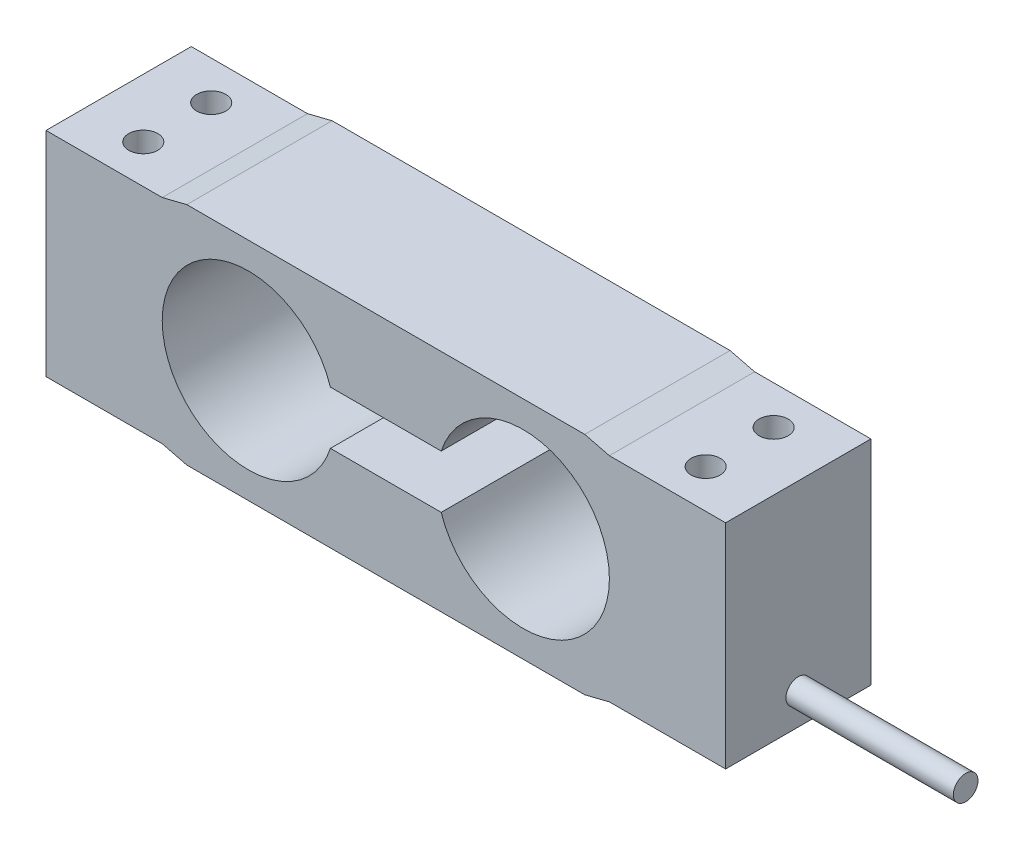
ISO-10303-21;
HEADER;
FILE_DESCRIPTION(('STEP AP214'),'2;1');
FILE_NAME('part.step','',(''),(''),'','','');
FILE_SCHEMA(('AUTOMOTIVE_DESIGN { 1 0 10303 214 1 1 1 1 }'));
ENDSEC;
DATA;
#1=APPLICATION_CONTEXT('core data for automotive mechanical design processes');
#2=APPLICATION_PROTOCOL_DEFINITION('international standard','automotive_design',2000,#1);
#3=PRODUCT_CONTEXT('',#1,'mechanical');
#4=PRODUCT('Part','Part','',(#3));
#5=PRODUCT_RELATED_PRODUCT_CATEGORY('part','',(#4));
#6=PRODUCT_DEFINITION_FORMATION('','',#4);
#7=PRODUCT_DEFINITION_CONTEXT('part definition',#1,'design');
#8=PRODUCT_DEFINITION('design','',#6,#7);
#9=PRODUCT_DEFINITION_SHAPE('','',#8);
#10=(LENGTH_UNIT() NAMED_UNIT(*) SI_UNIT(.MILLI.,.METRE.));
#11=(NAMED_UNIT(*) PLANE_ANGLE_UNIT() SI_UNIT($,.RADIAN.));
#12=(NAMED_UNIT(*) SI_UNIT($,.STERADIAN.) SOLID_ANGLE_UNIT());
#13=UNCERTAINTY_MEASURE_WITH_UNIT(LENGTH_MEASURE(1.E-05),#10,'distance_accuracy_value','');
#14=(GEOMETRIC_REPRESENTATION_CONTEXT(3) GLOBAL_UNCERTAINTY_ASSIGNED_CONTEXT((#13)) GLOBAL_UNIT_ASSIGNED_CONTEXT((#10,
#11,#12)) REPRESENTATION_CONTEXT('',''));
#15=CARTESIAN_POINT('',(0.,0.,0.));
#16=DIRECTION('',(0.,0.,1.));
#17=DIRECTION('',(1.,0.,0.));
#18=AXIS2_PLACEMENT_3D('',#15,#16,#17);
#19=CARTESIAN_POINT('',(0.,21.9964,-14.986));
#20=DIRECTION('',(0.,0.,1.));
#21=DIRECTION('',(1.,0.,0.));
#22=AXIS2_PLACEMENT_3D('',#19,#20,#21);
#23=PLANE('',#22);
#24=DIRECTION('',(0.,1.,0.));
#25=VECTOR('',#24,1.);
#26=CARTESIAN_POINT('',(-11.9888,21.9964,-14.986));
#27=LINE('',#26,#25);
#28=CARTESIAN_POINT('',(-11.9888,0.,-14.986));
#29=VERTEX_POINT('',#28);
#30=CARTESIAN_POINT('',(-11.9888,10.9982,-14.986));
#31=VERTEX_POINT('',#30);
#32=EDGE_CURVE('E44',#29,#31,#27,.T.);
#33=ORIENTED_EDGE('',*,*,#32,.F.);
#34=DIRECTION('',(0.970142500145333,0.242535625036327,0.));
#35=VECTOR('',#34,1.);
#36=CARTESIAN_POINT('',(-14.5288,-0.634999999999955,-14.986));
#37=LINE('',#36,#35);
#38=CARTESIAN_POINT('',(-14.5288,-0.634999999999955,-14.986));
#39=VERTEX_POINT('',#38);
#40=EDGE_CURVE('E226',#39,#29,#37,.T.);
#41=ORIENTED_EDGE('',*,*,#40,.F.);
#42=DIRECTION('',(1.,0.,0.));
#43=VECTOR('',#42,1.);
#44=CARTESIAN_POINT('',(-55.5752,-0.634999999999962,-14.986));
#45=LINE('',#44,#43);
#46=CARTESIAN_POINT('',(-55.5752,-0.634999999999962,-14.986));
#47=VERTEX_POINT('',#46);
#48=EDGE_CURVE('E222',#47,#39,#45,.T.);
#49=ORIENTED_EDGE('',*,*,#48,.F.);
#50=DIRECTION('',(0.970142500145334,-0.242535625036324,0.));
#51=VECTOR('',#50,1.);
#52=CARTESIAN_POINT('',(-58.1152,0.,-14.986));
#53=LINE('',#52,#51);
#54=CARTESIAN_POINT('',(-58.1152,0.,-14.986));
#55=VERTEX_POINT('',#54);
#56=EDGE_CURVE('E219',#55,#47,#53,.T.);
#57=ORIENTED_EDGE('',*,*,#56,.F.);
#58=DIRECTION('',(-1.,0.,0.));
#59=VECTOR('',#58,1.);
#60=CARTESIAN_POINT('',(0.,0.,-14.986));
#61=LINE('',#60,#59);
#62=CARTESIAN_POINT('',(-70.104,0.,-14.986));
#63=VERTEX_POINT('',#62);
#64=EDGE_CURVE('E329',#55,#63,#61,.T.);
#65=ORIENTED_EDGE('',*,*,#64,.T.);
#66=DIRECTION('',(0.,-1.,0.));
#67=VECTOR('',#66,1.);
#68=CARTESIAN_POINT('',(-70.104,21.9964,-14.986));
#69=LINE('',#68,#67);
#70=CARTESIAN_POINT('',(-70.104,21.9964,-14.986));
#71=VERTEX_POINT('',#70);
#72=EDGE_CURVE('E343',#71,#63,#69,.T.);
#73=ORIENTED_EDGE('',*,*,#72,.F.);
#74=DIRECTION('',(-1.,0.,0.));
#75=VECTOR('',#74,1.);
#76=CARTESIAN_POINT('',(0.,21.9964,-14.986));
#77=LINE('',#76,#75);
#78=CARTESIAN_POINT('',(-58.1152,21.9964,-14.986));
#79=VERTEX_POINT('',#78);
#80=EDGE_CURVE('E191',#79,#71,#77,.T.);
#81=ORIENTED_EDGE('',*,*,#80,.F.);
#82=DIRECTION('',(-0.970142500145334,-0.242535625036326,0.));
#83=VECTOR('',#82,1.);
#84=CARTESIAN_POINT('',(-58.1152,21.9964,-14.986));
#85=LINE('',#84,#83);
#86=CARTESIAN_POINT('',(-55.5752,22.6314,-14.986));
#87=VERTEX_POINT('',#86);
#88=EDGE_CURVE('E167',#87,#79,#85,.T.);
#89=ORIENTED_EDGE('',*,*,#88,.F.);
#90=DIRECTION('',(-1.,0.,0.));
#91=VECTOR('',#90,1.);
#92=CARTESIAN_POINT('',(-55.5752,22.6314,-14.986));
#93=LINE('',#92,#91);
#94=CARTESIAN_POINT('',(-14.5288,22.6314,-14.986));
#95=VERTEX_POINT('',#94);
#96=EDGE_CURVE('E165',#95,#87,#93,.T.);
#97=ORIENTED_EDGE('',*,*,#96,.F.);
#98=DIRECTION('',(-0.970142500145334,0.242535625036326,0.));
#99=VECTOR('',#98,1.);
#100=CARTESIAN_POINT('',(-14.5288,22.6314,-14.986));
#101=LINE('',#100,#99);
#102=CARTESIAN_POINT('',(-11.9888,21.9964,-14.986));
#103=VERTEX_POINT('',#102);
#104=EDGE_CURVE('E161',#103,#95,#101,.T.);
#105=ORIENTED_EDGE('',*,*,#104,.F.);
#106=EDGE_CURVE('E11',#31,#103,#27,.T.);
#107=ORIENTED_EDGE('',*,*,#106,.F.);
#108=CARTESIAN_POINT('',(-20.8788,10.9982,-14.986));
#109=DIRECTION('',(0.,0.,1.));
#110=DIRECTION('',(-1.,0.,0.));
#111=AXIS2_PLACEMENT_3D('',#108,#109,#110);
#112=CIRCLE('',#111,8.89);
#113=CARTESIAN_POINT('',(-29.337,13.7351604966094,-14.986));
#114=VERTEX_POINT('',#113);
#115=EDGE_CURVE('E287',#31,#114,#112,.T.);
#116=ORIENTED_EDGE('',*,*,#115,.T.);
#117=DIRECTION('',(-1.,0.,0.));
#118=VECTOR('',#117,1.);
#119=CARTESIAN_POINT('',(-29.337,13.7351604966094,-14.986));
#120=LINE('',#119,#118);
#121=CARTESIAN_POINT('',(-40.767,13.7351604966093,-14.986));
#122=VERTEX_POINT('',#121);
#123=EDGE_CURVE('E286',#114,#122,#120,.T.);
#124=ORIENTED_EDGE('',*,*,#123,.T.);
#125=CARTESIAN_POINT('',(-49.2252,10.9982,-14.986));
#126=DIRECTION('',(0.,0.,1.));
#127=DIRECTION('',(1.,0.,0.));
#128=AXIS2_PLACEMENT_3D('',#125,#126,#127);
#129=CIRCLE('',#128,8.89);
#130=CARTESIAN_POINT('',(-40.767,8.26123950339068,-14.986));
#131=VERTEX_POINT('',#130);
#132=EDGE_CURVE('E57',#122,#131,#129,.T.);
#133=ORIENTED_EDGE('',*,*,#132,.T.);
#134=DIRECTION('',(1.,0.,0.));
#135=VECTOR('',#134,1.);
#136=CARTESIAN_POINT('',(-29.337,8.26123950339068,-14.986));
#137=LINE('',#136,#135);
#138=CARTESIAN_POINT('',(-29.337,8.26123950339068,-14.986));
#139=VERTEX_POINT('',#138);
#140=EDGE_CURVE('E291',#131,#139,#137,.T.);
#141=ORIENTED_EDGE('',*,*,#140,.T.);
#142=EDGE_CURVE('E283',#139,#31,#112,.T.);
#143=ORIENTED_EDGE('',*,*,#142,.T.);
#144=EDGE_LOOP('',(#33,#41,#49,#57,#65,#73,#81,#89,#97,#105,#107,#116,#124,#133,#141,#143));
#145=FACE_BOUND('',#144,.T.);
#146=ADVANCED_FACE('F34',(#145),#23,.F.);
#147=CARTESIAN_POINT('',(0.,21.9964,0.));
#148=DIRECTION('',(-1.,0.,0.));
#149=DIRECTION('',(0.,0.,1.));
#150=AXIS2_PLACEMENT_3D('',#147,#148,#149);
#151=PLANE('',#150);
#152=DIRECTION('',(0.,0.,-1.));
#153=VECTOR('',#152,1.);
#154=CARTESIAN_POINT('',(0.,0.,0.));
#155=LINE('',#154,#153);
#156=CARTESIAN_POINT('',(0.,0.,0.));
#157=VERTEX_POINT('',#156);
#158=CARTESIAN_POINT('',(0.,0.,-14.986));
#159=VERTEX_POINT('',#158);
#160=EDGE_CURVE('E177',#157,#159,#155,.T.);
#161=ORIENTED_EDGE('',*,*,#160,.T.);
#162=DIRECTION('',(0.,-1.,0.));
#163=VECTOR('',#162,1.);
#164=CARTESIAN_POINT('',(0.,21.9964,-14.986));
#165=LINE('',#164,#163);
#166=CARTESIAN_POINT('',(0.,21.9964,-14.986));
#167=VERTEX_POINT('',#166);
#168=EDGE_CURVE('E345',#167,#159,#165,.T.);
#169=ORIENTED_EDGE('',*,*,#168,.F.);
#170=DIRECTION('',(0.,0.,-1.));
#171=VECTOR('',#170,1.);
#172=CARTESIAN_POINT('',(0.,21.9964,0.));
#173=LINE('',#172,#171);
#174=CARTESIAN_POINT('',(0.,21.9964,0.));
#175=VERTEX_POINT('',#174);
#176=EDGE_CURVE('E184',#175,#167,#173,.T.);
#177=ORIENTED_EDGE('',*,*,#176,.F.);
#178=DIRECTION('',(0.,-1.,0.));
#179=VECTOR('',#178,1.);
#180=CARTESIAN_POINT('',(0.,21.9964,0.));
#181=LINE('',#180,#179);
#182=EDGE_CURVE('E326',#175,#157,#181,.T.);
#183=ORIENTED_EDGE('',*,*,#182,.T.);
#184=EDGE_LOOP('',(#161,#169,#177,#183));
#185=FACE_BOUND('',#184,.T.);
#186=CARTESIAN_POINT('',(0.,3.23214606044077,-7.493));
#187=DIRECTION('',(-1.,0.,0.));
#188=DIRECTION('',(0.,0.,1.));
#189=AXIS2_PLACEMENT_3D('',#186,#187,#188);
#190=CIRCLE('',#189,1.27);
#191=CARTESIAN_POINT('',(0.,3.23214606044077,-6.223));
#192=VERTEX_POINT('',#191);
#193=EDGE_CURVE('E38',#192,#192,#190,.F.);
#194=ORIENTED_EDGE('',*,*,#193,.F.);
#195=EDGE_LOOP('',(#194));
#196=FACE_BOUND('',#195,.T.);
#197=ADVANCED_FACE('F36',(#185,#196),#151,.F.);
#198=CARTESIAN_POINT('',(0.,0.,-14.986));
#199=DIRECTION('',(0.,1.,0.));
#200=DIRECTION('',(0.,0.,1.));
#201=AXIS2_PLACEMENT_3D('',#198,#199,#200);
#202=PLANE('',#201);
#203=CARTESIAN_POINT('',(-64.0588,0.,-3.9878));
#204=DIRECTION('',(0.,1.,0.));
#205=DIRECTION('',(0.,0.,1.));
#206=AXIS2_PLACEMENT_3D('',#203,#204,#205);
#207=CIRCLE('',#206,1.5);
#208=CARTESIAN_POINT('',(-64.0588,0.,-2.4878));
#209=VERTEX_POINT('',#208);
#210=EDGE_CURVE('E271',#209,#209,#207,.T.);
#211=ORIENTED_EDGE('',*,*,#210,.T.);
#212=EDGE_LOOP('',(#211));
#213=FACE_BOUND('',#212,.T.);
#214=CARTESIAN_POINT('',(-64.0588,0.,-10.9982));
#215=DIRECTION('',(0.,1.,0.));
#216=DIRECTION('',(0.,0.,1.));
#217=AXIS2_PLACEMENT_3D('',#214,#215,#216);
#218=CIRCLE('',#217,1.5);
#219=CARTESIAN_POINT('',(-64.0588,0.,-9.4982));
#220=VERTEX_POINT('',#219);
#221=EDGE_CURVE('E277',#220,#220,#218,.T.);
#222=ORIENTED_EDGE('',*,*,#221,.T.);
#223=EDGE_LOOP('',(#222));
#224=FACE_BOUND('',#223,.T.);
#225=ORIENTED_EDGE('',*,*,#64,.F.);
#226=DIRECTION('',(0.,0.,1.));
#227=VECTOR('',#226,1.);
#228=CARTESIAN_POINT('',(-58.1152,0.,-14.986));
#229=LINE('',#228,#227);
#230=CARTESIAN_POINT('',(-58.1152,0.,0.));
#231=VERTEX_POINT('',#230);
#232=EDGE_CURVE('E314',#55,#231,#229,.T.);
#233=ORIENTED_EDGE('',*,*,#232,.T.);
#234=DIRECTION('',(1.,0.,0.));
#235=VECTOR('',#234,1.);
#236=CARTESIAN_POINT('',(0.,0.,0.));
#237=LINE('',#236,#235);
#238=CARTESIAN_POINT('',(-70.104,0.,0.));
#239=VERTEX_POINT('',#238);
#240=EDGE_CURVE('E320',#239,#231,#237,.T.);
#241=ORIENTED_EDGE('',*,*,#240,.F.);
#242=DIRECTION('',(0.,0.,1.));
#243=VECTOR('',#242,1.);
#244=CARTESIAN_POINT('',(-70.104,0.,0.));
#245=LINE('',#244,#243);
#246=EDGE_CURVE('E333',#63,#239,#245,.T.);
#247=ORIENTED_EDGE('',*,*,#246,.F.);
#248=EDGE_LOOP('',(#225,#233,#241,#247));
#249=FACE_BOUND('',#248,.T.);
#250=ADVANCED_FACE('F355',(#213,#224,#249),#202,.F.);
#251=CARTESIAN_POINT('',(0.,21.9964,-14.986));
#252=DIRECTION('',(0.,1.,0.));
#253=DIRECTION('',(0.,0.,1.));
#254=AXIS2_PLACEMENT_3D('',#251,#252,#253);
#255=PLANE('',#254);
#256=CARTESIAN_POINT('',(-6.0452,21.9964,-10.9982));
#257=DIRECTION('',(0.,1.,0.));
#258=DIRECTION('',(0.,0.,-1.));
#259=AXIS2_PLACEMENT_3D('',#256,#257,#258);
#260=CIRCLE('',#259,1.5);
#261=CARTESIAN_POINT('',(-6.0452,21.9964,-12.4982));
#262=VERTEX_POINT('',#261);
#263=EDGE_CURVE('E258',#262,#262,#260,.T.);
#264=ORIENTED_EDGE('',*,*,#263,.F.);
#265=EDGE_LOOP('',(#264));
#266=FACE_BOUND('',#265,.T.);
#267=CARTESIAN_POINT('',(-6.0452,21.9964,-3.98780000000001));
#268=DIRECTION('',(0.,1.,0.));
#269=DIRECTION('',(0.,0.,-1.));
#270=AXIS2_PLACEMENT_3D('',#267,#268,#269);
#271=CIRCLE('',#270,1.5);
#272=CARTESIAN_POINT('',(-6.0452,21.9964,-5.48780000000001));
#273=VERTEX_POINT('',#272);
#274=EDGE_CURVE('E262',#273,#273,#271,.T.);
#275=ORIENTED_EDGE('',*,*,#274,.F.);
#276=EDGE_LOOP('',(#275));
#277=FACE_BOUND('',#276,.T.);
#278=DIRECTION('',(0.,0.,1.));
#279=VECTOR('',#278,1.);
#280=CARTESIAN_POINT('',(-11.9888,21.9964,-14.986));
#281=LINE('',#280,#279);
#282=CARTESIAN_POINT('',(-11.9888,21.9964,0.));
#283=VERTEX_POINT('',#282);
#284=EDGE_CURVE('E170',#103,#283,#281,.T.);
#285=ORIENTED_EDGE('',*,*,#284,.T.);
#286=DIRECTION('',(1.,0.,0.));
#287=VECTOR('',#286,1.);
#288=CARTESIAN_POINT('',(0.,21.9964,0.));
#289=LINE('',#288,#287);
#290=EDGE_CURVE('E323',#283,#175,#289,.T.);
#291=ORIENTED_EDGE('',*,*,#290,.T.);
#292=ORIENTED_EDGE('',*,*,#176,.T.);
#293=EDGE_CURVE('E181',#167,#103,#77,.T.);
#294=ORIENTED_EDGE('',*,*,#293,.T.);
#295=EDGE_LOOP('',(#285,#291,#292,#294));
#296=FACE_BOUND('',#295,.T.);
#297=ADVANCED_FACE('F182',(#266,#277,#296),#255,.T.);
#298=CARTESIAN_POINT('',(-70.104,21.9964,0.));
#299=DIRECTION('',(1.,0.,0.));
#300=DIRECTION('',(0.,0.,-1.));
#301=AXIS2_PLACEMENT_3D('',#298,#299,#300);
#302=PLANE('',#301);
#303=ORIENTED_EDGE('',*,*,#246,.T.);
#304=DIRECTION('',(0.,-1.,0.));
#305=VECTOR('',#304,1.);
#306=CARTESIAN_POINT('',(-70.104,21.9964,0.));
#307=LINE('',#306,#305);
#308=CARTESIAN_POINT('',(-70.104,21.9964,0.));
#309=VERTEX_POINT('',#308);
#310=EDGE_CURVE('E340',#309,#239,#307,.T.);
#311=ORIENTED_EDGE('',*,*,#310,.F.);
#312=DIRECTION('',(0.,0.,1.));
#313=VECTOR('',#312,1.);
#314=CARTESIAN_POINT('',(-70.104,21.9964,0.));
#315=LINE('',#314,#313);
#316=EDGE_CURVE('E190',#71,#309,#315,.T.);
#317=ORIENTED_EDGE('',*,*,#316,.F.);
#318=ORIENTED_EDGE('',*,*,#72,.T.);
#319=EDGE_LOOP('',(#303,#311,#317,#318));
#320=FACE_BOUND('',#319,.T.);
#321=ADVANCED_FACE('F457',(#320),#302,.F.);
#322=CARTESIAN_POINT('',(0.,21.9964,0.));
#323=DIRECTION('',(0.,0.,-1.));
#324=DIRECTION('',(-1.,0.,0.));
#325=AXIS2_PLACEMENT_3D('',#322,#323,#324);
#326=PLANE('',#325);
#327=ORIENTED_EDGE('',*,*,#240,.T.);
#328=DIRECTION('',(0.970142500145334,-0.242535625036324,0.));
#329=VECTOR('',#328,1.);
#330=CARTESIAN_POINT('',(-58.1152,0.,0.));
#331=LINE('',#330,#329);
#332=CARTESIAN_POINT('',(-55.5752,-0.634999999999962,0.));
#333=VERTEX_POINT('',#332);
#334=EDGE_CURVE('E230',#231,#333,#331,.T.);
#335=ORIENTED_EDGE('',*,*,#334,.T.);
#336=DIRECTION('',(1.,0.,0.));
#337=VECTOR('',#336,1.);
#338=CARTESIAN_POINT('',(-55.5752,-0.634999999999962,0.));
#339=LINE('',#338,#337);
#340=CARTESIAN_POINT('',(-14.5288,-0.634999999999955,0.));
#341=VERTEX_POINT('',#340);
#342=EDGE_CURVE('E233',#333,#341,#339,.T.);
#343=ORIENTED_EDGE('',*,*,#342,.T.);
#344=DIRECTION('',(0.970142500145333,0.242535625036327,0.));
#345=VECTOR('',#344,1.);
#346=CARTESIAN_POINT('',(-14.5288,-0.634999999999955,0.));
#347=LINE('',#346,#345);
#348=CARTESIAN_POINT('',(-11.9888,0.,0.));
#349=VERTEX_POINT('',#348);
#350=EDGE_CURVE('E223',#341,#349,#347,.T.);
#351=ORIENTED_EDGE('',*,*,#350,.T.);
#352=EDGE_CURVE('E335',#349,#157,#237,.T.);
#353=ORIENTED_EDGE('',*,*,#352,.T.);
#354=ORIENTED_EDGE('',*,*,#182,.F.);
#355=ORIENTED_EDGE('',*,*,#290,.F.);
#356=DIRECTION('',(-0.970142500145334,0.242535625036326,0.));
#357=VECTOR('',#356,1.);
#358=CARTESIAN_POINT('',(-14.5288,22.6314,0.));
#359=LINE('',#358,#357);
#360=CARTESIAN_POINT('',(-14.5288,22.6314,0.));
#361=VERTEX_POINT('',#360);
#362=EDGE_CURVE('E174',#283,#361,#359,.T.);
#363=ORIENTED_EDGE('',*,*,#362,.T.);
#364=DIRECTION('',(-1.,0.,0.));
#365=VECTOR('',#364,1.);
#366=CARTESIAN_POINT('',(-55.5752,22.6314,0.));
#367=LINE('',#366,#365);
#368=CARTESIAN_POINT('',(-55.5752,22.6314,0.));
#369=VERTEX_POINT('',#368);
#370=EDGE_CURVE('E243',#361,#369,#367,.T.);
#371=ORIENTED_EDGE('',*,*,#370,.T.);
#372=DIRECTION('',(-0.970142500145334,-0.242535625036326,0.));
#373=VECTOR('',#372,1.);
#374=CARTESIAN_POINT('',(-58.1152,21.9964,0.));
#375=LINE('',#374,#373);
#376=CARTESIAN_POINT('',(-58.1152,21.9964,0.));
#377=VERTEX_POINT('',#376);
#378=EDGE_CURVE('E240',#369,#377,#375,.T.);
#379=ORIENTED_EDGE('',*,*,#378,.T.);
#380=EDGE_CURVE('E324',#309,#377,#289,.T.);
#381=ORIENTED_EDGE('',*,*,#380,.F.);
#382=ORIENTED_EDGE('',*,*,#310,.T.);
#383=EDGE_LOOP('',(#327,#335,#343,#351,#353,#354,#355,#363,#371,#379,#381,#382));
#384=FACE_BOUND('',#383,.T.);
#385=DIRECTION('',(-1.,0.,0.));
#386=VECTOR('',#385,1.);
#387=CARTESIAN_POINT('',(-29.337,13.7351604966094,0.));
#388=LINE('',#387,#386);
#389=CARTESIAN_POINT('',(-29.337,13.7351604966094,0.));
#390=VERTEX_POINT('',#389);
#391=CARTESIAN_POINT('',(-40.767,13.7351604966093,0.));
#392=VERTEX_POINT('',#391);
#393=EDGE_CURVE('E296',#390,#392,#388,.T.);
#394=ORIENTED_EDGE('',*,*,#393,.F.);
#395=CARTESIAN_POINT('',(-20.8788,10.9982,0.));
#396=DIRECTION('',(0.,0.,1.));
#397=DIRECTION('',(-1.,0.,0.));
#398=AXIS2_PLACEMENT_3D('',#395,#396,#397);
#399=CIRCLE('',#398,8.89);
#400=CARTESIAN_POINT('',(-29.337,8.26123950339068,0.));
#401=VERTEX_POINT('',#400);
#402=EDGE_CURVE('E280',#401,#390,#399,.T.);
#403=ORIENTED_EDGE('',*,*,#402,.F.);
#404=DIRECTION('',(1.,0.,0.));
#405=VECTOR('',#404,1.);
#406=CARTESIAN_POINT('',(-29.337,8.26123950339068,0.));
#407=LINE('',#406,#405);
#408=CARTESIAN_POINT('',(-40.767,8.26123950339068,0.));
#409=VERTEX_POINT('',#408);
#410=EDGE_CURVE('E302',#409,#401,#407,.T.);
#411=ORIENTED_EDGE('',*,*,#410,.F.);
#412=CARTESIAN_POINT('',(-49.2252,10.9982,0.));
#413=DIRECTION('',(0.,0.,1.));
#414=DIRECTION('',(1.,0.,0.));
#415=AXIS2_PLACEMENT_3D('',#412,#413,#414);
#416=CIRCLE('',#415,8.89);
#417=EDGE_CURVE('E299',#392,#409,#416,.T.);
#418=ORIENTED_EDGE('',*,*,#417,.F.);
#419=EDGE_LOOP('',(#394,#403,#411,#418));
#420=FACE_BOUND('',#419,.T.);
#421=ADVANCED_FACE('F450',(#384,#420),#326,.F.);
#422=CARTESIAN_POINT('',(-64.0588,21.9964,-3.9878));
#423=DIRECTION('',(0.,1.,0.));
#424=DIRECTION('',(0.,0.,1.));
#425=AXIS2_PLACEMENT_3D('',#422,#423,#424);
#426=CIRCLE('',#425,1.5);
#427=CARTESIAN_POINT('',(-64.0588,21.9964,-2.4878));
#428=VERTEX_POINT('',#427);
#429=EDGE_CURVE('E268',#428,#428,#426,.T.);
#430=ORIENTED_EDGE('',*,*,#429,.F.);
#431=EDGE_LOOP('',(#430));
#432=FACE_BOUND('',#431,.T.);
#433=CARTESIAN_POINT('',(-64.0588,21.9964,-10.9982));
#434=DIRECTION('',(0.,1.,0.));
#435=DIRECTION('',(0.,0.,1.));
#436=AXIS2_PLACEMENT_3D('',#433,#434,#435);
#437=CIRCLE('',#436,1.5);
#438=CARTESIAN_POINT('',(-64.0588,21.9964,-9.4982));
#439=VERTEX_POINT('',#438);
#440=EDGE_CURVE('E274',#439,#439,#437,.T.);
#441=ORIENTED_EDGE('',*,*,#440,.F.);
#442=EDGE_LOOP('',(#441));
#443=FACE_BOUND('',#442,.T.);
#444=DIRECTION('',(0.,0.,1.));
#445=VECTOR('',#444,1.);
#446=CARTESIAN_POINT('',(-58.1152,21.9964,-14.986));
#447=LINE('',#446,#445);
#448=EDGE_CURVE('E178',#79,#377,#447,.T.);
#449=ORIENTED_EDGE('',*,*,#448,.F.);
#450=ORIENTED_EDGE('',*,*,#80,.T.);
#451=ORIENTED_EDGE('',*,*,#316,.T.);
#452=ORIENTED_EDGE('',*,*,#380,.T.);
#453=EDGE_LOOP('',(#449,#450,#451,#452));
#454=FACE_BOUND('',#453,.T.);
#455=ADVANCED_FACE('F448',(#432,#443,#454),#255,.T.);
#456=CARTESIAN_POINT('',(-6.0452,0.,-10.9982));
#457=DIRECTION('',(0.,1.,0.));
#458=DIRECTION('',(0.,0.,-1.));
#459=AXIS2_PLACEMENT_3D('',#456,#457,#458);
#460=CIRCLE('',#459,1.5);
#461=CARTESIAN_POINT('',(-6.0452,0.,-12.4982));
#462=VERTEX_POINT('',#461);
#463=EDGE_CURVE('E259',#462,#462,#460,.T.);
#464=ORIENTED_EDGE('',*,*,#463,.T.);
#465=EDGE_LOOP('',(#464));
#466=FACE_BOUND('',#465,.T.);
#467=CARTESIAN_POINT('',(-6.0452,0.,-3.98780000000001));
#468=DIRECTION('',(0.,1.,0.));
#469=DIRECTION('',(0.,0.,-1.));
#470=AXIS2_PLACEMENT_3D('',#467,#468,#469);
#471=CIRCLE('',#470,1.5);
#472=CARTESIAN_POINT('',(-6.0452,0.,-5.48780000000001));
#473=VERTEX_POINT('',#472);
#474=EDGE_CURVE('E265',#473,#473,#471,.T.);
#475=ORIENTED_EDGE('',*,*,#474,.T.);
#476=EDGE_LOOP('',(#475));
#477=FACE_BOUND('',#476,.T.);
#478=ORIENTED_EDGE('',*,*,#352,.F.);
#479=DIRECTION('',(0.,0.,1.));
#480=VECTOR('',#479,1.);
#481=CARTESIAN_POINT('',(-11.9888,0.,-14.986));
#482=LINE('',#481,#480);
#483=EDGE_CURVE('E307',#29,#349,#482,.T.);
#484=ORIENTED_EDGE('',*,*,#483,.F.);
#485=EDGE_CURVE('E330',#159,#29,#61,.T.);
#486=ORIENTED_EDGE('',*,*,#485,.F.);
#487=ORIENTED_EDGE('',*,*,#160,.F.);
#488=EDGE_LOOP('',(#478,#484,#486,#487));
#489=FACE_BOUND('',#488,.T.);
#490=ADVANCED_FACE('F363',(#466,#477,#489),#202,.F.);
#491=CARTESIAN_POINT('',(-20.8788,10.9982,-14.986));
#492=DIRECTION('',(0.,0.,1.));
#493=DIRECTION('',(1.,0.,0.));
#494=AXIS2_PLACEMENT_3D('',#491,#492,#493);
#495=CYLINDRICAL_SURFACE('',#494,8.89);
#496=ORIENTED_EDGE('',*,*,#402,.T.);
#497=DIRECTION('',(0.,0.,1.));
#498=VECTOR('',#497,1.);
#499=CARTESIAN_POINT('',(-29.337,13.7351604966094,-14.986));
#500=LINE('',#499,#498);
#501=EDGE_CURVE('E294',#114,#390,#500,.T.);
#502=ORIENTED_EDGE('',*,*,#501,.F.);
#503=ORIENTED_EDGE('',*,*,#115,.F.);
#504=ORIENTED_EDGE('',*,*,#142,.F.);
#505=DIRECTION('',(0.,0.,1.));
#506=VECTOR('',#505,1.);
#507=CARTESIAN_POINT('',(-29.337,8.26123950339068,-14.986));
#508=LINE('',#507,#506);
#509=EDGE_CURVE('E305',#139,#401,#508,.T.);
#510=ORIENTED_EDGE('',*,*,#509,.T.);
#511=EDGE_LOOP('',(#496,#502,#503,#504,#510));
#512=FACE_BOUND('',#511,.T.);
#513=ADVANCED_FACE('F438',(#512),#495,.F.);
#514=CARTESIAN_POINT('',(-29.337,8.26123950339068,-14.986));
#515=DIRECTION('',(0.,-1.,0.));
#516=DIRECTION('',(1.,0.,0.));
#517=AXIS2_PLACEMENT_3D('',#514,#515,#516);
#518=PLANE('',#517);
#519=ORIENTED_EDGE('',*,*,#410,.T.);
#520=ORIENTED_EDGE('',*,*,#509,.F.);
#521=ORIENTED_EDGE('',*,*,#140,.F.);
#522=DIRECTION('',(0.,0.,1.));
#523=VECTOR('',#522,1.);
#524=CARTESIAN_POINT('',(-40.767,8.26123950339068,-14.986));
#525=LINE('',#524,#523);
#526=EDGE_CURVE('E308',#131,#409,#525,.T.);
#527=ORIENTED_EDGE('',*,*,#526,.T.);
#528=EDGE_LOOP('',(#519,#520,#521,#527));
#529=FACE_BOUND('',#528,.T.);
#530=ADVANCED_FACE('F434',(#529),#518,.F.);
#531=CARTESIAN_POINT('',(-49.2252,10.9982,-14.986));
#532=DIRECTION('',(0.,0.,1.));
#533=DIRECTION('',(1.,0.,0.));
#534=AXIS2_PLACEMENT_3D('',#531,#532,#533);
#535=CYLINDRICAL_SURFACE('',#534,8.89);
#536=ORIENTED_EDGE('',*,*,#417,.T.);
#537=ORIENTED_EDGE('',*,*,#526,.F.);
#538=ORIENTED_EDGE('',*,*,#132,.F.);
#539=DIRECTION('',(0.,0.,1.));
#540=VECTOR('',#539,1.);
#541=CARTESIAN_POINT('',(-40.767,13.7351604966093,-14.986));
#542=LINE('',#541,#540);
#543=EDGE_CURVE('E310',#122,#392,#542,.T.);
#544=ORIENTED_EDGE('',*,*,#543,.T.);
#545=EDGE_LOOP('',(#536,#537,#538,#544));
#546=FACE_BOUND('',#545,.T.);
#547=ADVANCED_FACE('F437',(#546),#535,.F.);
#548=CARTESIAN_POINT('',(-29.337,13.7351604966094,-14.986));
#549=DIRECTION('',(0.,1.,0.));
#550=DIRECTION('',(-1.,0.,0.));
#551=AXIS2_PLACEMENT_3D('',#548,#549,#550);
#552=PLANE('',#551);
#553=ORIENTED_EDGE('',*,*,#393,.T.);
#554=ORIENTED_EDGE('',*,*,#543,.F.);
#555=ORIENTED_EDGE('',*,*,#123,.F.);
#556=ORIENTED_EDGE('',*,*,#501,.T.);
#557=EDGE_LOOP('',(#553,#554,#555,#556));
#558=FACE_BOUND('',#557,.T.);
#559=ADVANCED_FACE('F432',(#558),#552,.F.);
#560=CARTESIAN_POINT('',(-64.0588,0.,-10.9982));
#561=DIRECTION('',(0.,1.,0.));
#562=DIRECTION('',(0.,0.,1.));
#563=AXIS2_PLACEMENT_3D('',#560,#561,#562);
#564=CYLINDRICAL_SURFACE('',#563,1.5);
#565=ORIENTED_EDGE('',*,*,#221,.F.);
#566=EDGE_LOOP('',(#565));
#567=FACE_BOUND('',#566,.T.);
#568=ORIENTED_EDGE('',*,*,#440,.T.);
#569=EDGE_LOOP('',(#568));
#570=FACE_BOUND('',#569,.T.);
#571=ADVANCED_FACE('F428',(#567,#570),#564,.F.);
#572=CARTESIAN_POINT('',(-64.0588,0.,-3.9878));
#573=DIRECTION('',(0.,1.,0.));
#574=DIRECTION('',(0.,0.,1.));
#575=AXIS2_PLACEMENT_3D('',#572,#573,#574);
#576=CYLINDRICAL_SURFACE('',#575,1.5);
#577=ORIENTED_EDGE('',*,*,#210,.F.);
#578=EDGE_LOOP('',(#577));
#579=FACE_BOUND('',#578,.T.);
#580=ORIENTED_EDGE('',*,*,#429,.T.);
#581=EDGE_LOOP('',(#580));
#582=FACE_BOUND('',#581,.T.);
#583=ADVANCED_FACE('F424',(#579,#582),#576,.F.);
#584=CARTESIAN_POINT('',(-6.0452,0.,-3.98780000000001));
#585=DIRECTION('',(0.,1.,0.));
#586=DIRECTION('',(0.,0.,1.));
#587=AXIS2_PLACEMENT_3D('',#584,#585,#586);
#588=CYLINDRICAL_SURFACE('',#587,1.5);
#589=ORIENTED_EDGE('',*,*,#474,.F.);
#590=EDGE_LOOP('',(#589));
#591=FACE_BOUND('',#590,.T.);
#592=ORIENTED_EDGE('',*,*,#274,.T.);
#593=EDGE_LOOP('',(#592));
#594=FACE_BOUND('',#593,.T.);
#595=ADVANCED_FACE('F420',(#591,#594),#588,.F.);
#596=CARTESIAN_POINT('',(-6.0452,0.,-10.9982));
#597=DIRECTION('',(0.,1.,0.));
#598=DIRECTION('',(0.,0.,1.));
#599=AXIS2_PLACEMENT_3D('',#596,#597,#598);
#600=CYLINDRICAL_SURFACE('',#599,1.5);
#601=ORIENTED_EDGE('',*,*,#463,.F.);
#602=EDGE_LOOP('',(#601));
#603=FACE_BOUND('',#602,.T.);
#604=ORIENTED_EDGE('',*,*,#263,.T.);
#605=EDGE_LOOP('',(#604));
#606=FACE_BOUND('',#605,.T.);
#607=ADVANCED_FACE('F416',(#603,#606),#600,.F.);
#608=CARTESIAN_POINT('',(17.272,3.23214606044077,-7.493));
#609=DIRECTION('',(-1.,0.,0.));
#610=DIRECTION('',(0.,0.,1.));
#611=AXIS2_PLACEMENT_3D('',#608,#609,#610);
#612=CYLINDRICAL_SURFACE('',#611,1.27);
#613=CARTESIAN_POINT('',(17.272,3.23214606044077,-7.493));
#614=DIRECTION('',(1.,0.,0.));
#615=DIRECTION('',(0.,0.,-1.));
#616=AXIS2_PLACEMENT_3D('',#613,#614,#615);
#617=CIRCLE('',#616,1.27);
#618=CARTESIAN_POINT('',(17.272,3.23214606044077,-8.763));
#619=VERTEX_POINT('',#618);
#620=EDGE_CURVE('E254',#619,#619,#617,.T.);
#621=ORIENTED_EDGE('',*,*,#620,.F.);
#622=EDGE_LOOP('',(#621));
#623=FACE_BOUND('',#622,.T.);
#624=ORIENTED_EDGE('',*,*,#193,.T.);
#625=EDGE_LOOP('',(#624));
#626=FACE_BOUND('',#625,.T.);
#627=ADVANCED_FACE('F352',(#623,#626),#612,.T.);
#628=CARTESIAN_POINT('',(17.272,3.23214606044077,-7.493));
#629=DIRECTION('',(1.,0.,0.));
#630=DIRECTION('',(0.,0.,-1.));
#631=AXIS2_PLACEMENT_3D('',#628,#629,#630);
#632=PLANE('',#631);
#633=ORIENTED_EDGE('',*,*,#620,.T.);
#634=EDGE_LOOP('',(#633));
#635=FACE_BOUND('',#634,.T.);
#636=ADVANCED_FACE('F409',(#635),#632,.T.);
#637=CARTESIAN_POINT('',(-58.1152,21.9964,-14.986));
#638=DIRECTION('',(-0.242535625036326,0.970142500145334,0.));
#639=DIRECTION('',(-0.970142500145334,-0.242535625036326,0.));
#640=AXIS2_PLACEMENT_3D('',#637,#638,#639);
#641=PLANE('',#640);
#642=ORIENTED_EDGE('',*,*,#378,.F.);
#643=DIRECTION('',(0.,0.,1.));
#644=VECTOR('',#643,1.);
#645=CARTESIAN_POINT('',(-55.5752,22.6314,-14.986));
#646=LINE('',#645,#644);
#647=EDGE_CURVE('E252',#87,#369,#646,.T.);
#648=ORIENTED_EDGE('',*,*,#647,.F.);
#649=ORIENTED_EDGE('',*,*,#88,.T.);
#650=ORIENTED_EDGE('',*,*,#448,.T.);
#651=EDGE_LOOP('',(#642,#648,#649,#650));
#652=FACE_BOUND('',#651,.T.);
#653=ADVANCED_FACE('F403',(#652),#641,.T.);
#654=CARTESIAN_POINT('',(-55.5752,22.6314,-14.986));
#655=DIRECTION('',(0.,1.,0.));
#656=DIRECTION('',(0.,0.,1.));
#657=AXIS2_PLACEMENT_3D('',#654,#655,#656);
#658=PLANE('',#657);
#659=ORIENTED_EDGE('',*,*,#370,.F.);
#660=DIRECTION('',(0.,0.,1.));
#661=VECTOR('',#660,1.);
#662=CARTESIAN_POINT('',(-14.5288,22.6314,-14.986));
#663=LINE('',#662,#661);
#664=EDGE_CURVE('E246',#95,#361,#663,.T.);
#665=ORIENTED_EDGE('',*,*,#664,.F.);
#666=ORIENTED_EDGE('',*,*,#96,.T.);
#667=ORIENTED_EDGE('',*,*,#647,.T.);
#668=EDGE_LOOP('',(#659,#665,#666,#667));
#669=FACE_BOUND('',#668,.T.);
#670=ADVANCED_FACE('F400',(#669),#658,.T.);
#671=CARTESIAN_POINT('',(-14.5288,22.6314,-14.986));
#672=DIRECTION('',(0.242535625036326,0.970142500145334,0.));
#673=DIRECTION('',(-0.970142500145334,0.242535625036326,0.));
#674=AXIS2_PLACEMENT_3D('',#671,#672,#673);
#675=PLANE('',#674);
#676=ORIENTED_EDGE('',*,*,#362,.F.);
#677=ORIENTED_EDGE('',*,*,#284,.F.);
#678=ORIENTED_EDGE('',*,*,#104,.T.);
#679=ORIENTED_EDGE('',*,*,#664,.T.);
#680=EDGE_LOOP('',(#676,#677,#678,#679));
#681=FACE_BOUND('',#680,.T.);
#682=ADVANCED_FACE('F172',(#681),#675,.T.);
#683=CARTESIAN_POINT('',(-58.1152,0.,-14.986));
#684=DIRECTION('',(-0.242535625036324,-0.970142500145334,0.));
#685=DIRECTION('',(0.970142500145334,-0.242535625036324,0.));
#686=AXIS2_PLACEMENT_3D('',#683,#684,#685);
#687=PLANE('',#686);
#688=ORIENTED_EDGE('',*,*,#334,.F.);
#689=ORIENTED_EDGE('',*,*,#232,.F.);
#690=ORIENTED_EDGE('',*,*,#56,.T.);
#691=DIRECTION('',(0.,0.,1.));
#692=VECTOR('',#691,1.);
#693=CARTESIAN_POINT('',(-55.5752,-0.634999999999962,-14.986));
#694=LINE('',#693,#692);
#695=EDGE_CURVE('E229',#47,#333,#694,.T.);
#696=ORIENTED_EDGE('',*,*,#695,.T.);
#697=EDGE_LOOP('',(#688,#689,#690,#696));
#698=FACE_BOUND('',#697,.T.);
#699=ADVANCED_FACE('F392',(#698),#687,.T.);
#700=CARTESIAN_POINT('',(-14.5288,-0.634999999999955,-14.986));
#701=DIRECTION('',(0.242535625036327,-0.970142500145333,0.));
#702=DIRECTION('',(0.970142500145333,0.242535625036327,0.));
#703=AXIS2_PLACEMENT_3D('',#700,#701,#702);
#704=PLANE('',#703);
#705=ORIENTED_EDGE('',*,*,#350,.F.);
#706=DIRECTION('',(0.,0.,1.));
#707=VECTOR('',#706,1.);
#708=CARTESIAN_POINT('',(-14.5288,-0.634999999999955,-14.986));
#709=LINE('',#708,#707);
#710=EDGE_CURVE('E238',#39,#341,#709,.T.);
#711=ORIENTED_EDGE('',*,*,#710,.F.);
#712=ORIENTED_EDGE('',*,*,#40,.T.);
#713=ORIENTED_EDGE('',*,*,#483,.T.);
#714=EDGE_LOOP('',(#705,#711,#712,#713));
#715=FACE_BOUND('',#714,.T.);
#716=ADVANCED_FACE('F389',(#715),#704,.T.);
#717=CARTESIAN_POINT('',(-55.5752,-0.634999999999962,-14.986));
#718=DIRECTION('',(0.,-1.,0.));
#719=DIRECTION('',(1.,0.,0.));
#720=AXIS2_PLACEMENT_3D('',#717,#718,#719);
#721=PLANE('',#720);
#722=ORIENTED_EDGE('',*,*,#342,.F.);
#723=ORIENTED_EDGE('',*,*,#695,.F.);
#724=ORIENTED_EDGE('',*,*,#48,.T.);
#725=ORIENTED_EDGE('',*,*,#710,.T.);
#726=EDGE_LOOP('',(#722,#723,#724,#725));
#727=FACE_BOUND('',#726,.T.);
#728=ADVANCED_FACE('F383',(#727),#721,.T.);
#729=CARTESIAN_POINT('',(0.,21.9964,-14.986));
#730=DIRECTION('',(0.707106781186546,0.,-0.707106781186549));
#731=DIRECTION('',(-0.707106781186549,0.,-0.707106781186546));
#732=AXIS2_PLACEMENT_3D('',#729,#730,#731);
#733=PLANE('',#732);
#734=ORIENTED_EDGE('',*,*,#168,.T.);
#735=DIRECTION('',(0.577350269189626,-0.577350269189627,0.577350269189625));
#736=VECTOR('',#735,1.);
#737=CARTESIAN_POINT('',(0.,0.,-14.986));
#738=LINE('',#737,#736);
#739=CARTESIAN_POINT('',(-0.508000000000002,0.508000000000002,-15.494));
#740=VERTEX_POINT('',#739);
#741=EDGE_CURVE('E206',#740,#159,#738,.T.);
#742=ORIENTED_EDGE('',*,*,#741,.F.);
#743=DIRECTION('',(0.,1.,0.));
#744=VECTOR('',#743,1.);
#745=CARTESIAN_POINT('',(-0.508000000000002,21.9964,-15.494));
#746=LINE('',#745,#744);
#747=CARTESIAN_POINT('',(-0.508000000000002,21.4884,-15.494));
#748=VERTEX_POINT('',#747);
#749=EDGE_CURVE('E211',#748,#740,#746,.F.);
#750=ORIENTED_EDGE('',*,*,#749,.F.);
#751=DIRECTION('',(0.577350269189626,0.577350269189627,0.577350269189625));
#752=VECTOR('',#751,1.);
#753=CARTESIAN_POINT('',(0.,21.9964,-14.986));
#754=LINE('',#753,#752);
#755=EDGE_CURVE('E204',#748,#167,#754,.T.);
#756=ORIENTED_EDGE('',*,*,#755,.T.);
#757=EDGE_LOOP('',(#734,#742,#750,#756));
#758=FACE_BOUND('',#757,.T.);
#759=ADVANCED_FACE('F372',(#758),#733,.T.);
#760=CARTESIAN_POINT('',(0.,0.,-14.986));
#761=DIRECTION('',(0.,-0.707106781186546,-0.707106781186549));
#762=DIRECTION('',(0.,0.707106781186549,-0.707106781186546));
#763=AXIS2_PLACEMENT_3D('',#760,#761,#762);
#764=PLANE('',#763);
#765=ORIENTED_EDGE('',*,*,#485,.T.);
#766=DIRECTION('',(-0.577350269189627,-0.577350269189627,0.577350269189624));
#767=VECTOR('',#766,1.);
#768=CARTESIAN_POINT('',(-4.65666666666666,7.33213333333335,-22.3181333333333));
#769=LINE('',#768,#767);
#770=CARTESIAN_POINT('',(-11.4808,0.508000000000002,-15.494));
#771=VERTEX_POINT('',#770);
#772=EDGE_CURVE('E203',#771,#29,#769,.T.);
#773=ORIENTED_EDGE('',*,*,#772,.F.);
#774=DIRECTION('',(1.,0.,0.));
#775=VECTOR('',#774,1.);
#776=CARTESIAN_POINT('',(0.,0.508000000000002,-15.494));
#777=LINE('',#776,#775);
#778=EDGE_CURVE('E214',#740,#771,#777,.F.);
#779=ORIENTED_EDGE('',*,*,#778,.F.);
#780=ORIENTED_EDGE('',*,*,#741,.T.);
#781=EDGE_LOOP('',(#765,#773,#779,#780));
#782=FACE_BOUND('',#781,.T.);
#783=ADVANCED_FACE('F369',(#782),#764,.T.);
#784=CARTESIAN_POINT('',(-11.9888,21.9964,-14.986));
#785=DIRECTION('',(-0.707106781186546,0.,-0.707106781186549));
#786=DIRECTION('',(-0.707106781186549,0.,0.707106781186546));
#787=AXIS2_PLACEMENT_3D('',#784,#785,#786);
#788=PLANE('',#787);
#789=ORIENTED_EDGE('',*,*,#32,.T.);
#790=ORIENTED_EDGE('',*,*,#106,.T.);
#791=DIRECTION('',(-0.577350269189627,0.577350269189627,0.577350269189624));
#792=VECTOR('',#791,1.);
#793=CARTESIAN_POINT('',(-7.99253333333333,18.0001333333333,-18.9822666666667));
#794=LINE('',#793,#792);
#795=CARTESIAN_POINT('',(-11.4808,21.4884,-15.494));
#796=VERTEX_POINT('',#795);
#797=EDGE_CURVE('E198',#796,#103,#794,.T.);
#798=ORIENTED_EDGE('',*,*,#797,.F.);
#799=DIRECTION('',(0.,-1.,0.));
#800=VECTOR('',#799,1.);
#801=CARTESIAN_POINT('',(-11.4808,21.9964,-15.494));
#802=LINE('',#801,#800);
#803=EDGE_CURVE('E216',#771,#796,#802,.F.);
#804=ORIENTED_EDGE('',*,*,#803,.F.);
#805=ORIENTED_EDGE('',*,*,#772,.T.);
#806=EDGE_LOOP('',(#789,#790,#798,#804,#805));
#807=FACE_BOUND('',#806,.T.);
#808=ADVANCED_FACE('F196',(#807),#788,.T.);
#809=CARTESIAN_POINT('',(0.,21.9964,-14.986));
#810=DIRECTION('',(0.,0.707106781186546,-0.707106781186549));
#811=DIRECTION('',(0.,0.707106781186549,0.707106781186546));
#812=AXIS2_PLACEMENT_3D('',#809,#810,#811);
#813=PLANE('',#812);
#814=ORIENTED_EDGE('',*,*,#293,.F.);
#815=ORIENTED_EDGE('',*,*,#755,.F.);
#816=DIRECTION('',(-1.,0.,0.));
#817=VECTOR('',#816,1.);
#818=CARTESIAN_POINT('',(0.,21.4884,-15.494));
#819=LINE('',#818,#817);
#820=EDGE_CURVE('E202',#796,#748,#819,.F.);
#821=ORIENTED_EDGE('',*,*,#820,.F.);
#822=ORIENTED_EDGE('',*,*,#797,.T.);
#823=EDGE_LOOP('',(#814,#815,#821,#822));
#824=FACE_BOUND('',#823,.T.);
#825=ADVANCED_FACE('F201',(#824),#813,.T.);
#826=CARTESIAN_POINT('',(0.,0.,-15.494));
#827=DIRECTION('',(0.,0.,-1.));
#828=DIRECTION('',(-1.,0.,0.));
#829=AXIS2_PLACEMENT_3D('',#826,#827,#828);
#830=PLANE('',#829);
#831=ORIENTED_EDGE('',*,*,#749,.T.);
#832=ORIENTED_EDGE('',*,*,#778,.T.);
#833=ORIENTED_EDGE('',*,*,#803,.T.);
#834=ORIENTED_EDGE('',*,*,#820,.T.);
#835=EDGE_LOOP('',(#831,#832,#833,#834));
#836=FACE_BOUND('',#835,.T.);
#837=ADVANCED_FACE('F374',(#836),#830,.T.);
#838=CLOSED_SHELL('',(#146,#197,#250,#297,#321,#421,#455,#490,#513,#530,#547,#559,#571,#583,
#595,#607,#627,#636,#653,#670,#682,#699,#716,#728,#759,#783,#808,#825,#837));
#839=MANIFOLD_SOLID_BREP('B2',#838);
#840=ADVANCED_BREP_SHAPE_REPRESENTATION('',(#18,#839),#14);
#841=SHAPE_DEFINITION_REPRESENTATION(#9,#840);
ENDSEC;
END-ISO-10303-21;
